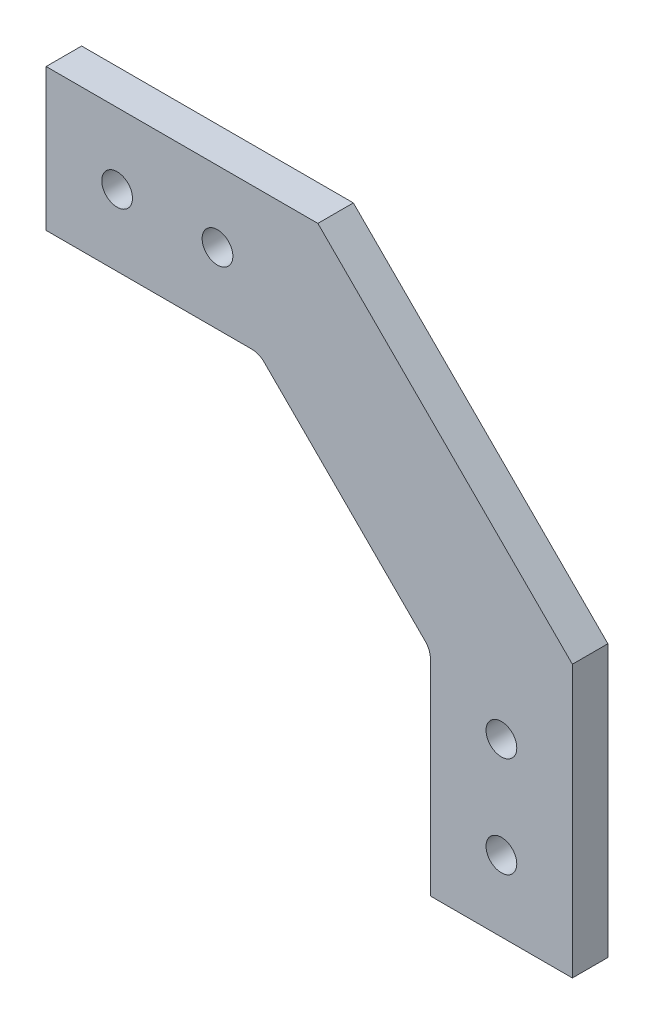
ISO-10303-21;
HEADER;
FILE_DESCRIPTION(('STEP AP214'),'2;1');
FILE_NAME('part.step','',(''),(''),'','','');
FILE_SCHEMA(('AUTOMOTIVE_DESIGN { 1 0 10303 214 1 1 1 1 }'));
ENDSEC;
DATA;
#1=APPLICATION_CONTEXT('core data for automotive mechanical design processes');
#2=APPLICATION_PROTOCOL_DEFINITION('international standard','automotive_design',2000,#1);
#3=PRODUCT_CONTEXT('',#1,'mechanical');
#4=PRODUCT('Part','Part','',(#3));
#5=PRODUCT_RELATED_PRODUCT_CATEGORY('part','',(#4));
#6=PRODUCT_DEFINITION_FORMATION('','',#4);
#7=PRODUCT_DEFINITION_CONTEXT('part definition',#1,'design');
#8=PRODUCT_DEFINITION('design','',#6,#7);
#9=PRODUCT_DEFINITION_SHAPE('','',#8);
#10=(LENGTH_UNIT() NAMED_UNIT(*) SI_UNIT(.MILLI.,.METRE.));
#11=(NAMED_UNIT(*) PLANE_ANGLE_UNIT() SI_UNIT($,.RADIAN.));
#12=(NAMED_UNIT(*) SI_UNIT($,.STERADIAN.) SOLID_ANGLE_UNIT());
#13=UNCERTAINTY_MEASURE_WITH_UNIT(LENGTH_MEASURE(1.E-05),#10,'distance_accuracy_value','');
#14=(GEOMETRIC_REPRESENTATION_CONTEXT(3) GLOBAL_UNCERTAINTY_ASSIGNED_CONTEXT((#13)) GLOBAL_UNIT_ASSIGNED_CONTEXT((#10,
#11,#12)) REPRESENTATION_CONTEXT('',''));
#15=CARTESIAN_POINT('',(0.,0.,0.));
#16=DIRECTION('',(0.,0.,1.));
#17=DIRECTION('',(1.,0.,0.));
#18=AXIS2_PLACEMENT_3D('',#15,#16,#17);
#19=CARTESIAN_POINT('',(12.7,20.1394877578617,6.35));
#20=DIRECTION('',(0.,1.,0.));
#21=DIRECTION('',(0.,0.,1.));
#22=AXIS2_PLACEMENT_3D('',#19,#20,#21);
#23=PLANE('',#22);
#24=DIRECTION('',(1.,0.,0.));
#25=VECTOR('',#24,1.);
#26=CARTESIAN_POINT('',(12.7,20.1394877578617,0.));
#27=LINE('',#26,#25);
#28=CARTESIAN_POINT('',(-12.7,20.1394877578617,0.));
#29=VERTEX_POINT('',#28);
#30=CARTESIAN_POINT('',(12.7,20.1394877578617,0.));
#31=VERTEX_POINT('',#30);
#32=EDGE_CURVE('E171',#29,#31,#27,.T.);
#33=ORIENTED_EDGE('',*,*,#32,.T.);
#34=DIRECTION('',(0.,0.,-1.));
#35=VECTOR('',#34,1.);
#36=CARTESIAN_POINT('',(12.7,20.1394877578617,6.35));
#37=LINE('',#36,#35);
#38=CARTESIAN_POINT('',(12.7,20.1394877578617,6.35));
#39=VERTEX_POINT('',#38);
#40=EDGE_CURVE('E122',#39,#31,#37,.T.);
#41=ORIENTED_EDGE('',*,*,#40,.F.);
#42=DIRECTION('',(1.,0.,0.));
#43=VECTOR('',#42,1.);
#44=CARTESIAN_POINT('',(12.7,20.1394877578617,6.35));
#45=LINE('',#44,#43);
#46=CARTESIAN_POINT('',(-12.7,20.1394877578617,6.35));
#47=VERTEX_POINT('',#46);
#48=EDGE_CURVE('E111',#47,#39,#45,.T.);
#49=ORIENTED_EDGE('',*,*,#48,.F.);
#50=DIRECTION('',(0.,0.,-1.));
#51=VECTOR('',#50,1.);
#52=CARTESIAN_POINT('',(-12.7,20.1394877578617,6.35));
#53=LINE('',#52,#51);
#54=EDGE_CURVE('E120',#47,#29,#53,.T.);
#55=ORIENTED_EDGE('',*,*,#54,.T.);
#56=EDGE_LOOP('',(#33,#41,#49,#55));
#57=FACE_BOUND('',#56,.T.);
#58=ADVANCED_FACE('F33',(#57),#23,.F.);
#59=CARTESIAN_POINT('',(12.7,68.7605122421383,6.35));
#60=DIRECTION('',(-1.,0.,0.));
#61=DIRECTION('',(0.,-1.,0.));
#62=AXIS2_PLACEMENT_3D('',#59,#60,#61);
#63=PLANE('',#62);
#64=DIRECTION('',(0.,1.,0.));
#65=VECTOR('',#64,1.);
#66=CARTESIAN_POINT('',(12.7,68.7605122421383,0.));
#67=LINE('',#66,#65);
#68=CARTESIAN_POINT('',(12.7,68.7605122421383,0.));
#69=VERTEX_POINT('',#68);
#70=EDGE_CURVE('E187',#31,#69,#67,.T.);
#71=ORIENTED_EDGE('',*,*,#70,.T.);
#72=DIRECTION('',(0.,0.,-1.));
#73=VECTOR('',#72,1.);
#74=CARTESIAN_POINT('',(12.7,68.7605122421383,6.35));
#75=LINE('',#74,#73);
#76=CARTESIAN_POINT('',(12.7,68.7605122421383,6.35));
#77=VERTEX_POINT('',#76);
#78=EDGE_CURVE('E133',#77,#69,#75,.T.);
#79=ORIENTED_EDGE('',*,*,#78,.F.);
#80=DIRECTION('',(0.,1.,0.));
#81=VECTOR('',#80,1.);
#82=CARTESIAN_POINT('',(12.7,29.0294877578617,6.35));
#83=LINE('',#82,#81);
#84=EDGE_CURVE('E124',#39,#77,#83,.T.);
#85=ORIENTED_EDGE('',*,*,#84,.F.);
#86=ORIENTED_EDGE('',*,*,#40,.T.);
#87=EDGE_LOOP('',(#71,#79,#85,#86));
#88=FACE_BOUND('',#87,.T.);
#89=ADVANCED_FACE('F232',(#88),#63,.F.);
#90=CARTESIAN_POINT('',(-32.8394877578616,114.3,6.35));
#91=DIRECTION('',(-0.707106781186547,-0.707106781186548,0.));
#92=DIRECTION('',(0.707106781186548,-0.707106781186547,0.));
#93=AXIS2_PLACEMENT_3D('',#90,#91,#92);
#94=PLANE('',#93);
#95=DIRECTION('',(-0.707106781186548,0.707106781186547,0.));
#96=VECTOR('',#95,1.);
#97=CARTESIAN_POINT('',(-32.8394877578616,114.3,0.));
#98=LINE('',#97,#96);
#99=CARTESIAN_POINT('',(-32.8394877578616,114.3,0.));
#100=VERTEX_POINT('',#99);
#101=EDGE_CURVE('E189',#69,#100,#98,.T.);
#102=ORIENTED_EDGE('',*,*,#101,.T.);
#103=DIRECTION('',(0.,0.,-1.));
#104=VECTOR('',#103,1.);
#105=CARTESIAN_POINT('',(-32.8394877578616,114.3,6.35));
#106=LINE('',#105,#104);
#107=CARTESIAN_POINT('',(-32.8394877578616,114.3,6.35));
#108=VERTEX_POINT('',#107);
#109=EDGE_CURVE('E207',#108,#100,#106,.T.);
#110=ORIENTED_EDGE('',*,*,#109,.F.);
#111=DIRECTION('',(-0.707106781186548,0.707106781186547,0.));
#112=VECTOR('',#111,1.);
#113=CARTESIAN_POINT('',(-32.8394877578616,114.3,6.35));
#114=LINE('',#113,#112);
#115=EDGE_CURVE('E174',#77,#108,#114,.T.);
#116=ORIENTED_EDGE('',*,*,#115,.F.);
#117=ORIENTED_EDGE('',*,*,#78,.T.);
#118=EDGE_LOOP('',(#102,#110,#116,#117));
#119=FACE_BOUND('',#118,.T.);
#120=ADVANCED_FACE('F214',(#119),#94,.F.);
#121=CARTESIAN_POINT('',(-81.4605122421383,114.3,6.35));
#122=DIRECTION('',(0.,-1.,0.));
#123=DIRECTION('',(0.,0.,-1.));
#124=AXIS2_PLACEMENT_3D('',#121,#122,#123);
#125=PLANE('',#124);
#126=DIRECTION('',(-1.,0.,0.));
#127=VECTOR('',#126,1.);
#128=CARTESIAN_POINT('',(-81.4605122421383,114.3,0.));
#129=LINE('',#128,#127);
#130=CARTESIAN_POINT('',(-81.4605122421383,114.3,0.));
#131=VERTEX_POINT('',#130);
#132=EDGE_CURVE('E191',#100,#131,#129,.T.);
#133=ORIENTED_EDGE('',*,*,#132,.T.);
#134=DIRECTION('',(0.,0.,-1.));
#135=VECTOR('',#134,1.);
#136=CARTESIAN_POINT('',(-81.4605122421383,114.3,6.35));
#137=LINE('',#136,#135);
#138=CARTESIAN_POINT('',(-81.4605122421383,114.3,6.35));
#139=VERTEX_POINT('',#138);
#140=EDGE_CURVE('E204',#139,#131,#137,.T.);
#141=ORIENTED_EDGE('',*,*,#140,.F.);
#142=DIRECTION('',(-1.,0.,0.));
#143=VECTOR('',#142,1.);
#144=CARTESIAN_POINT('',(-81.4605122421383,114.3,6.35));
#145=LINE('',#144,#143);
#146=EDGE_CURVE('E176',#108,#139,#145,.T.);
#147=ORIENTED_EDGE('',*,*,#146,.F.);
#148=ORIENTED_EDGE('',*,*,#109,.T.);
#149=EDGE_LOOP('',(#133,#141,#147,#148));
#150=FACE_BOUND('',#149,.T.);
#151=ADVANCED_FACE('F224',(#150),#125,.F.);
#152=CARTESIAN_POINT('',(-81.4605122421383,88.8999999999999,6.35));
#153=DIRECTION('',(1.,0.,0.));
#154=DIRECTION('',(0.,0.,-1.));
#155=AXIS2_PLACEMENT_3D('',#152,#153,#154);
#156=PLANE('',#155);
#157=DIRECTION('',(0.,-1.,0.));
#158=VECTOR('',#157,1.);
#159=CARTESIAN_POINT('',(-81.4605122421383,88.8999999999999,0.));
#160=LINE('',#159,#158);
#161=CARTESIAN_POINT('',(-81.4605122421383,88.8999999999999,0.));
#162=VERTEX_POINT('',#161);
#163=EDGE_CURVE('E193',#131,#162,#160,.T.);
#164=ORIENTED_EDGE('',*,*,#163,.T.);
#165=DIRECTION('',(0.,0.,-1.));
#166=VECTOR('',#165,1.);
#167=CARTESIAN_POINT('',(-81.4605122421383,88.8999999999999,6.35));
#168=LINE('',#167,#166);
#169=CARTESIAN_POINT('',(-81.4605122421383,88.8999999999999,6.35));
#170=VERTEX_POINT('',#169);
#171=EDGE_CURVE('E185',#170,#162,#168,.T.);
#172=ORIENTED_EDGE('',*,*,#171,.F.);
#173=DIRECTION('',(0.,-1.,0.));
#174=VECTOR('',#173,1.);
#175=CARTESIAN_POINT('',(-81.4605122421383,88.8999999999999,6.35));
#176=LINE('',#175,#174);
#177=EDGE_CURVE('E178',#139,#170,#176,.T.);
#178=ORIENTED_EDGE('',*,*,#177,.F.);
#179=ORIENTED_EDGE('',*,*,#140,.T.);
#180=EDGE_LOOP('',(#164,#172,#178,#179));
#181=FACE_BOUND('',#180,.T.);
#182=ADVANCED_FACE('F228',(#181),#156,.F.);
#183=CARTESIAN_POINT('',(-43.3605122421383,88.8999999999999,6.35));
#184=DIRECTION('',(0.,1.,0.));
#185=DIRECTION('',(-1.,0.,0.));
#186=AXIS2_PLACEMENT_3D('',#183,#184,#185);
#187=PLANE('',#186);
#188=DIRECTION('',(1.,0.,0.));
#189=VECTOR('',#188,1.);
#190=CARTESIAN_POINT('',(-43.3605122421383,88.8999999999999,0.));
#191=LINE('',#190,#189);
#192=CARTESIAN_POINT('',(-44.6756403026729,88.8999999999999,0.));
#193=VERTEX_POINT('',#192);
#194=EDGE_CURVE('E195',#162,#193,#191,.T.);
#195=ORIENTED_EDGE('',*,*,#194,.T.);
#196=DIRECTION('',(0.,0.,-1.));
#197=VECTOR('',#196,1.);
#198=CARTESIAN_POINT('',(-44.6756403026729,88.8999999999999,6.35));
#199=LINE('',#198,#197);
#200=CARTESIAN_POINT('',(-44.6756403026729,88.8999999999999,6.35));
#201=VERTEX_POINT('',#200);
#202=EDGE_CURVE('E139',#193,#201,#199,.F.);
#203=ORIENTED_EDGE('',*,*,#202,.T.);
#204=DIRECTION('',(1.,0.,0.));
#205=VECTOR('',#204,1.);
#206=CARTESIAN_POINT('',(-43.3605122421383,88.8999999999999,6.35));
#207=LINE('',#206,#205);
#208=EDGE_CURVE('E180',#170,#201,#207,.T.);
#209=ORIENTED_EDGE('',*,*,#208,.F.);
#210=ORIENTED_EDGE('',*,*,#171,.T.);
#211=EDGE_LOOP('',(#195,#203,#209,#210));
#212=FACE_BOUND('',#211,.T.);
#213=ADVANCED_FACE('F259',(#212),#187,.F.);
#214=CARTESIAN_POINT('',(-12.7,58.2394877578617,6.35));
#215=DIRECTION('',(0.707106781186547,0.707106781186548,0.));
#216=DIRECTION('',(-0.707106781186548,0.707106781186547,0.));
#217=AXIS2_PLACEMENT_3D('',#214,#215,#216);
#218=PLANE('',#217);
#219=DIRECTION('',(0.707106781186548,-0.707106781186547,0.));
#220=VECTOR('',#219,1.);
#221=CARTESIAN_POINT('',(-12.7,58.2394877578617,6.35));
#222=LINE('',#221,#220);
#223=CARTESIAN_POINT('',(-42.4305762724056,87.9700640302673,6.35));
#224=VERTEX_POINT('',#223);
#225=CARTESIAN_POINT('',(-13.6299359697327,59.1694237275944,6.35));
#226=VERTEX_POINT('',#225);
#227=EDGE_CURVE('E183',#224,#226,#222,.T.);
#228=ORIENTED_EDGE('',*,*,#227,.F.);
#229=DIRECTION('',(0.,0.,-1.));
#230=VECTOR('',#229,1.);
#231=CARTESIAN_POINT('',(-42.4305762724056,87.9700640302673,0.));
#232=LINE('',#231,#230);
#233=CARTESIAN_POINT('',(-42.4305762724056,87.9700640302673,0.));
#234=VERTEX_POINT('',#233);
#235=EDGE_CURVE('E131',#224,#234,#232,.T.);
#236=ORIENTED_EDGE('',*,*,#235,.T.);
#237=DIRECTION('',(0.707106781186548,-0.707106781186547,0.));
#238=VECTOR('',#237,1.);
#239=CARTESIAN_POINT('',(-12.7,58.2394877578617,0.));
#240=LINE('',#239,#238);
#241=CARTESIAN_POINT('',(-13.6299359697327,59.1694237275944,0.));
#242=VERTEX_POINT('',#241);
#243=EDGE_CURVE('E198',#234,#242,#240,.T.);
#244=ORIENTED_EDGE('',*,*,#243,.T.);
#245=DIRECTION('',(0.,0.,-1.));
#246=VECTOR('',#245,1.);
#247=CARTESIAN_POINT('',(-13.6299359697327,59.1694237275944,6.35));
#248=LINE('',#247,#246);
#249=EDGE_CURVE('E129',#242,#226,#248,.F.);
#250=ORIENTED_EDGE('',*,*,#249,.T.);
#251=EDGE_LOOP('',(#228,#236,#244,#250));
#252=FACE_BOUND('',#251,.T.);
#253=ADVANCED_FACE('F256',(#252),#218,.F.);
#254=CARTESIAN_POINT('',(-12.7,29.0294877578617,6.35));
#255=DIRECTION('',(1.,0.,0.));
#256=DIRECTION('',(0.,1.,0.));
#257=AXIS2_PLACEMENT_3D('',#254,#255,#256);
#258=PLANE('',#257);
#259=DIRECTION('',(0.,-1.,0.));
#260=VECTOR('',#259,1.);
#261=CARTESIAN_POINT('',(-12.7,20.1394877578617,6.35));
#262=LINE('',#261,#260);
#263=CARTESIAN_POINT('',(-12.7,56.9243596973271,6.35));
#264=VERTEX_POINT('',#263);
#265=EDGE_CURVE('E108',#264,#47,#262,.T.);
#266=ORIENTED_EDGE('',*,*,#265,.F.);
#267=DIRECTION('',(0.,0.,-1.));
#268=VECTOR('',#267,1.);
#269=CARTESIAN_POINT('',(-12.7,56.9243596973271,0.));
#270=LINE('',#269,#268);
#271=CARTESIAN_POINT('',(-12.7,56.9243596973271,0.));
#272=VERTEX_POINT('',#271);
#273=EDGE_CURVE('E141',#264,#272,#270,.T.);
#274=ORIENTED_EDGE('',*,*,#273,.T.);
#275=DIRECTION('',(0.,-1.,0.));
#276=VECTOR('',#275,1.);
#277=CARTESIAN_POINT('',(-12.7,29.0294877578617,0.));
#278=LINE('',#277,#276);
#279=EDGE_CURVE('E115',#272,#29,#278,.T.);
#280=ORIENTED_EDGE('',*,*,#279,.T.);
#281=ORIENTED_EDGE('',*,*,#54,.F.);
#282=EDGE_LOOP('',(#266,#274,#280,#281));
#283=FACE_BOUND('',#282,.T.);
#284=ADVANCED_FACE('F126',(#283),#258,.F.);
#285=CARTESIAN_POINT('',(0.,0.,6.35));
#286=DIRECTION('',(0.,0.,1.));
#287=DIRECTION('',(1.,0.,0.));
#288=AXIS2_PLACEMENT_3D('',#285,#286,#287);
#289=PLANE('',#288);
#290=CARTESIAN_POINT('',(0.,50.8,6.35));
#291=DIRECTION('',(0.,0.,1.));
#292=DIRECTION('',(1.,0.,0.));
#293=AXIS2_PLACEMENT_3D('',#290,#291,#292);
#294=CIRCLE('',#293,2.74999999999999);
#295=CARTESIAN_POINT('',(2.74999999999998,50.8,6.35));
#296=VERTEX_POINT('',#295);
#297=EDGE_CURVE('E164',#296,#296,#294,.T.);
#298=ORIENTED_EDGE('',*,*,#297,.F.);
#299=EDGE_LOOP('',(#298));
#300=FACE_BOUND('',#299,.T.);
#301=CARTESIAN_POINT('',(-50.7999999999996,101.6,6.35));
#302=DIRECTION('',(0.,0.,1.));
#303=DIRECTION('',(1.,0.,0.));
#304=AXIS2_PLACEMENT_3D('',#301,#302,#303);
#305=CIRCLE('',#304,2.74999999999999);
#306=CARTESIAN_POINT('',(-48.0499999999996,101.6,6.35));
#307=VERTEX_POINT('',#306);
#308=EDGE_CURVE('E154',#307,#307,#305,.T.);
#309=ORIENTED_EDGE('',*,*,#308,.F.);
#310=EDGE_LOOP('',(#309));
#311=FACE_BOUND('',#310,.T.);
#312=CARTESIAN_POINT('',(-68.7605122421383,101.6,6.35));
#313=DIRECTION('',(0.,0.,1.));
#314=DIRECTION('',(1.,0.,0.));
#315=AXIS2_PLACEMENT_3D('',#312,#313,#314);
#316=CIRCLE('',#315,2.74999999999999);
#317=CARTESIAN_POINT('',(-66.0105122421383,101.6,6.35));
#318=VERTEX_POINT('',#317);
#319=EDGE_CURVE('E151',#318,#318,#316,.T.);
#320=ORIENTED_EDGE('',*,*,#319,.F.);
#321=EDGE_LOOP('',(#320));
#322=FACE_BOUND('',#321,.T.);
#323=CARTESIAN_POINT('',(0.,32.8394877578617,6.35));
#324=DIRECTION('',(0.,0.,1.));
#325=DIRECTION('',(1.,0.,0.));
#326=AXIS2_PLACEMENT_3D('',#323,#324,#325);
#327=CIRCLE('',#326,2.74999999999999);
#328=CARTESIAN_POINT('',(2.74999999999998,32.8394877578617,6.35));
#329=VERTEX_POINT('',#328);
#330=EDGE_CURVE('E150',#329,#329,#327,.T.);
#331=ORIENTED_EDGE('',*,*,#330,.F.);
#332=EDGE_LOOP('',(#331));
#333=FACE_BOUND('',#332,.T.);
#334=ORIENTED_EDGE('',*,*,#227,.T.);
#335=CARTESIAN_POINT('',(-15.875,56.9243596973271,6.35));
#336=DIRECTION('',(0.,0.,1.));
#337=DIRECTION('',(1.,0.,0.));
#338=AXIS2_PLACEMENT_3D('',#335,#336,#337);
#339=CIRCLE('',#338,3.175);
#340=EDGE_CURVE('E11',#226,#264,#339,.F.);
#341=ORIENTED_EDGE('',*,*,#340,.T.);
#342=ORIENTED_EDGE('',*,*,#265,.T.);
#343=ORIENTED_EDGE('',*,*,#48,.T.);
#344=ORIENTED_EDGE('',*,*,#84,.T.);
#345=ORIENTED_EDGE('',*,*,#115,.T.);
#346=ORIENTED_EDGE('',*,*,#146,.T.);
#347=ORIENTED_EDGE('',*,*,#177,.T.);
#348=ORIENTED_EDGE('',*,*,#208,.T.);
#349=CARTESIAN_POINT('',(-44.6756403026729,85.725,6.35));
#350=DIRECTION('',(0.,0.,1.));
#351=DIRECTION('',(1.,0.,0.));
#352=AXIS2_PLACEMENT_3D('',#349,#350,#351);
#353=CIRCLE('',#352,3.175);
#354=EDGE_CURVE('E145',#201,#224,#353,.F.);
#355=ORIENTED_EDGE('',*,*,#354,.T.);
#356=EDGE_LOOP('',(#334,#341,#342,#343,#344,#345,#346,#347,#348,#355));
#357=FACE_BOUND('',#356,.T.);
#358=ADVANCED_FACE('F110',(#300,#311,#322,#333,#357),#289,.T.);
#359=CARTESIAN_POINT('',(0.,0.,0.));
#360=DIRECTION('',(0.,0.,1.));
#361=DIRECTION('',(1.,0.,0.));
#362=AXIS2_PLACEMENT_3D('',#359,#360,#361);
#363=PLANE('',#362);
#364=CARTESIAN_POINT('',(0.,50.8,0.));
#365=DIRECTION('',(0.,0.,1.));
#366=DIRECTION('',(1.,0.,0.));
#367=AXIS2_PLACEMENT_3D('',#364,#365,#366);
#368=CIRCLE('',#367,2.74999999999999);
#369=CARTESIAN_POINT('',(2.74999999999998,50.8,0.));
#370=VERTEX_POINT('',#369);
#371=EDGE_CURVE('E37',#370,#370,#368,.T.);
#372=ORIENTED_EDGE('',*,*,#371,.T.);
#373=EDGE_LOOP('',(#372));
#374=FACE_BOUND('',#373,.T.);
#375=CARTESIAN_POINT('',(-50.7999999999996,101.6,0.));
#376=DIRECTION('',(0.,0.,1.));
#377=DIRECTION('',(1.,0.,0.));
#378=AXIS2_PLACEMENT_3D('',#375,#376,#377);
#379=CIRCLE('',#378,2.74999999999999);
#380=CARTESIAN_POINT('',(-48.0499999999996,101.6,0.));
#381=VERTEX_POINT('',#380);
#382=EDGE_CURVE('E152',#381,#381,#379,.T.);
#383=ORIENTED_EDGE('',*,*,#382,.T.);
#384=EDGE_LOOP('',(#383));
#385=FACE_BOUND('',#384,.T.);
#386=CARTESIAN_POINT('',(-68.7605122421383,101.6,0.));
#387=DIRECTION('',(0.,0.,1.));
#388=DIRECTION('',(1.,0.,0.));
#389=AXIS2_PLACEMENT_3D('',#386,#387,#388);
#390=CIRCLE('',#389,2.74999999999999);
#391=CARTESIAN_POINT('',(-66.0105122421383,101.6,0.));
#392=VERTEX_POINT('',#391);
#393=EDGE_CURVE('E148',#392,#392,#390,.T.);
#394=ORIENTED_EDGE('',*,*,#393,.T.);
#395=EDGE_LOOP('',(#394));
#396=FACE_BOUND('',#395,.T.);
#397=CARTESIAN_POINT('',(0.,32.8394877578617,0.));
#398=DIRECTION('',(0.,0.,1.));
#399=DIRECTION('',(1.,0.,0.));
#400=AXIS2_PLACEMENT_3D('',#397,#398,#399);
#401=CIRCLE('',#400,2.74999999999999);
#402=CARTESIAN_POINT('',(2.74999999999998,32.8394877578617,0.));
#403=VERTEX_POINT('',#402);
#404=EDGE_CURVE('E169',#403,#403,#401,.T.);
#405=ORIENTED_EDGE('',*,*,#404,.T.);
#406=EDGE_LOOP('',(#405));
#407=FACE_BOUND('',#406,.T.);
#408=ORIENTED_EDGE('',*,*,#32,.F.);
#409=ORIENTED_EDGE('',*,*,#279,.F.);
#410=CARTESIAN_POINT('',(-15.875,56.9243596973271,0.));
#411=DIRECTION('',(0.,0.,1.));
#412=DIRECTION('',(1.,0.,0.));
#413=AXIS2_PLACEMENT_3D('',#410,#411,#412);
#414=CIRCLE('',#413,3.175);
#415=EDGE_CURVE('E42',#272,#242,#414,.T.);
#416=ORIENTED_EDGE('',*,*,#415,.T.);
#417=ORIENTED_EDGE('',*,*,#243,.F.);
#418=CARTESIAN_POINT('',(-44.6756403026729,85.725,0.));
#419=DIRECTION('',(0.,0.,1.));
#420=DIRECTION('',(1.,0.,0.));
#421=AXIS2_PLACEMENT_3D('',#418,#419,#420);
#422=CIRCLE('',#421,3.175);
#423=EDGE_CURVE('E143',#234,#193,#422,.T.);
#424=ORIENTED_EDGE('',*,*,#423,.T.);
#425=ORIENTED_EDGE('',*,*,#194,.F.);
#426=ORIENTED_EDGE('',*,*,#163,.F.);
#427=ORIENTED_EDGE('',*,*,#132,.F.);
#428=ORIENTED_EDGE('',*,*,#101,.F.);
#429=ORIENTED_EDGE('',*,*,#70,.F.);
#430=EDGE_LOOP('',(#408,#409,#416,#417,#424,#425,#426,#427,#428,#429));
#431=FACE_BOUND('',#430,.T.);
#432=ADVANCED_FACE('F219',(#374,#385,#396,#407,#431),#363,.F.);
#433=CARTESIAN_POINT('',(-44.6756403026729,85.725,6.35));
#434=DIRECTION('',(0.,0.,1.));
#435=DIRECTION('',(1.,0.,0.));
#436=AXIS2_PLACEMENT_3D('',#433,#434,#435);
#437=CYLINDRICAL_SURFACE('',#436,3.175);
#438=ORIENTED_EDGE('',*,*,#354,.F.);
#439=ORIENTED_EDGE('',*,*,#202,.F.);
#440=ORIENTED_EDGE('',*,*,#423,.F.);
#441=ORIENTED_EDGE('',*,*,#235,.F.);
#442=EDGE_LOOP('',(#438,#439,#440,#441));
#443=FACE_BOUND('',#442,.T.);
#444=ADVANCED_FACE('F242',(#443),#437,.F.);
#445=CARTESIAN_POINT('',(-15.875,56.9243596973271,6.35));
#446=DIRECTION('',(0.,0.,1.));
#447=DIRECTION('',(1.,0.,0.));
#448=AXIS2_PLACEMENT_3D('',#445,#446,#447);
#449=CYLINDRICAL_SURFACE('',#448,3.175);
#450=ORIENTED_EDGE('',*,*,#340,.F.);
#451=ORIENTED_EDGE('',*,*,#249,.F.);
#452=ORIENTED_EDGE('',*,*,#415,.F.);
#453=ORIENTED_EDGE('',*,*,#273,.F.);
#454=EDGE_LOOP('',(#450,#451,#452,#453));
#455=FACE_BOUND('',#454,.T.);
#456=ADVANCED_FACE('F35',(#455),#449,.F.);
#457=CARTESIAN_POINT('',(0.,32.8394877578617,6.35));
#458=DIRECTION('',(0.,0.,1.));
#459=DIRECTION('',(1.,0.,0.));
#460=AXIS2_PLACEMENT_3D('',#457,#458,#459);
#461=CYLINDRICAL_SURFACE('',#460,2.74999999999999);
#462=ORIENTED_EDGE('',*,*,#330,.T.);
#463=EDGE_LOOP('',(#462));
#464=FACE_BOUND('',#463,.T.);
#465=ORIENTED_EDGE('',*,*,#404,.F.);
#466=EDGE_LOOP('',(#465));
#467=FACE_BOUND('',#466,.T.);
#468=ADVANCED_FACE('F249',(#464,#467),#461,.F.);
#469=CARTESIAN_POINT('',(-68.7605122421383,101.6,6.35));
#470=DIRECTION('',(0.,0.,1.));
#471=DIRECTION('',(1.,0.,0.));
#472=AXIS2_PLACEMENT_3D('',#469,#470,#471);
#473=CYLINDRICAL_SURFACE('',#472,2.74999999999999);
#474=ORIENTED_EDGE('',*,*,#319,.T.);
#475=EDGE_LOOP('',(#474));
#476=FACE_BOUND('',#475,.T.);
#477=ORIENTED_EDGE('',*,*,#393,.F.);
#478=EDGE_LOOP('',(#477));
#479=FACE_BOUND('',#478,.T.);
#480=ADVANCED_FACE('F330',(#476,#479),#473,.F.);
#481=CARTESIAN_POINT('',(-50.7999999999996,101.6,6.35));
#482=DIRECTION('',(0.,0.,1.));
#483=DIRECTION('',(1.,0.,0.));
#484=AXIS2_PLACEMENT_3D('',#481,#482,#483);
#485=CYLINDRICAL_SURFACE('',#484,2.74999999999999);
#486=ORIENTED_EDGE('',*,*,#308,.T.);
#487=EDGE_LOOP('',(#486));
#488=FACE_BOUND('',#487,.T.);
#489=ORIENTED_EDGE('',*,*,#382,.F.);
#490=EDGE_LOOP('',(#489));
#491=FACE_BOUND('',#490,.T.);
#492=ADVANCED_FACE('F340',(#488,#491),#485,.F.);
#493=CARTESIAN_POINT('',(0.,50.8,6.35));
#494=DIRECTION('',(0.,0.,1.));
#495=DIRECTION('',(1.,0.,0.));
#496=AXIS2_PLACEMENT_3D('',#493,#494,#495);
#497=CYLINDRICAL_SURFACE('',#496,2.74999999999999);
#498=ORIENTED_EDGE('',*,*,#297,.T.);
#499=EDGE_LOOP('',(#498));
#500=FACE_BOUND('',#499,.T.);
#501=ORIENTED_EDGE('',*,*,#371,.F.);
#502=EDGE_LOOP('',(#501));
#503=FACE_BOUND('',#502,.T.);
#504=ADVANCED_FACE('F350',(#500,#503),#497,.F.);
#505=CLOSED_SHELL('',(#58,#89,#120,#151,#182,#213,#253,#284,#358,#432,#444,#456,#468,#480,#492,#504));
#506=MANIFOLD_SOLID_BREP('B2',#505);
#507=ADVANCED_BREP_SHAPE_REPRESENTATION('',(#18,#506),#14);
#508=SHAPE_DEFINITION_REPRESENTATION(#9,#507);
ENDSEC;
END-ISO-10303-21;
